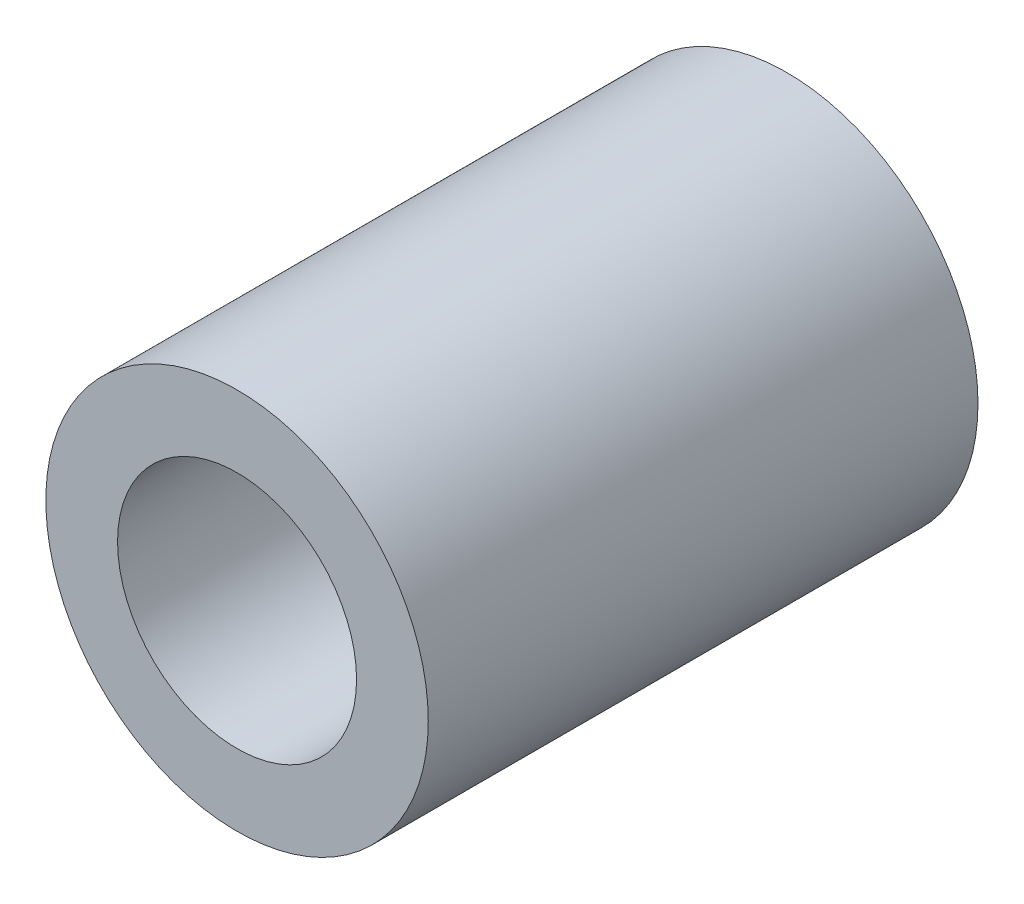
ISO-10303-21;
HEADER;
FILE_DESCRIPTION(('STEP AP214'),'2;1');
FILE_NAME('part.step','',(''),(''),'','','');
FILE_SCHEMA(('AUTOMOTIVE_DESIGN { 1 0 10303 214 1 1 1 1 }'));
ENDSEC;
DATA;
#1=APPLICATION_CONTEXT('core data for automotive mechanical design processes');
#2=APPLICATION_PROTOCOL_DEFINITION('international standard','automotive_design',2000,#1);
#3=PRODUCT_CONTEXT('',#1,'mechanical');
#4=PRODUCT('Part','Part','',(#3));
#5=PRODUCT_RELATED_PRODUCT_CATEGORY('part','',(#4));
#6=PRODUCT_DEFINITION_FORMATION('','',#4);
#7=PRODUCT_DEFINITION_CONTEXT('part definition',#1,'design');
#8=PRODUCT_DEFINITION('design','',#6,#7);
#9=PRODUCT_DEFINITION_SHAPE('','',#8);
#10=(LENGTH_UNIT() NAMED_UNIT(*) SI_UNIT(.MILLI.,.METRE.));
#11=(NAMED_UNIT(*) PLANE_ANGLE_UNIT() SI_UNIT($,.RADIAN.));
#12=(NAMED_UNIT(*) SI_UNIT($,.STERADIAN.) SOLID_ANGLE_UNIT());
#13=UNCERTAINTY_MEASURE_WITH_UNIT(LENGTH_MEASURE(1.E-05),#10,'distance_accuracy_value','');
#14=(GEOMETRIC_REPRESENTATION_CONTEXT(3) GLOBAL_UNCERTAINTY_ASSIGNED_CONTEXT((#13)) GLOBAL_UNIT_ASSIGNED_CONTEXT((#10,
#11,#12)) REPRESENTATION_CONTEXT('',''));
#15=CARTESIAN_POINT('',(0.,0.,0.));
#16=DIRECTION('',(0.,0.,1.));
#17=DIRECTION('',(1.,0.,0.));
#18=AXIS2_PLACEMENT_3D('',#15,#16,#17);
#19=CARTESIAN_POINT('',(0.,0.,23.));
#20=DIRECTION('',(0.,0.,-1.));
#21=DIRECTION('',(-1.00000000000001,0.,0.));
#22=AXIS2_PLACEMENT_3D('',#19,#20,#21);
#23=CYLINDRICAL_SURFACE('',#22,2.5);
#24=CARTESIAN_POINT('',(0.,0.,0.));
#25=DIRECTION('',(0.,0.,1.));
#26=DIRECTION('',(1.00000000000001,0.,0.));
#27=AXIS2_PLACEMENT_3D('',#24,#25,#26);
#28=CIRCLE('',#27,2.5);
#29=CARTESIAN_POINT('',(2.50000000000002,0.,0.));
#30=VERTEX_POINT('',#29);
#31=EDGE_CURVE('E58',#30,#30,#28,.T.);
#32=ORIENTED_EDGE('',*,*,#31,.F.);
#33=EDGE_LOOP('',(#32));
#34=FACE_BOUND('',#33,.T.);
#35=CARTESIAN_POINT('',(0.,0.,11.5));
#36=DIRECTION('',(0.,0.,1.));
#37=DIRECTION('',(1.00000000000001,0.,0.));
#38=AXIS2_PLACEMENT_3D('',#35,#36,#37);
#39=CIRCLE('',#38,2.5);
#40=CARTESIAN_POINT('',(2.50000000000001,0.,11.5));
#41=VERTEX_POINT('',#40);
#42=EDGE_CURVE('E46',#41,#41,#39,.T.);
#43=ORIENTED_EDGE('',*,*,#42,.T.);
#44=EDGE_LOOP('',(#43));
#45=FACE_BOUND('',#44,.T.);
#46=ADVANCED_FACE('F42',(#34,#45),#23,.F.);
#47=CARTESIAN_POINT('',(0.,0.,23.));
#48=DIRECTION('',(0.,0.,1.));
#49=DIRECTION('',(1.00000000000001,0.,0.));
#50=AXIS2_PLACEMENT_3D('',#47,#48,#49);
#51=PLANE('',#50);
#52=CARTESIAN_POINT('',(0.,0.,23.));
#53=DIRECTION('',(0.,0.,1.));
#54=DIRECTION('',(1.00000000000001,0.,0.));
#55=AXIS2_PLACEMENT_3D('',#52,#53,#54);
#56=CIRCLE('',#55,5.);
#57=CARTESIAN_POINT('',(5.00000000000003,0.,23.));
#58=VERTEX_POINT('',#57);
#59=EDGE_CURVE('E63',#58,#58,#56,.T.);
#60=ORIENTED_EDGE('',*,*,#59,.F.);
#61=EDGE_LOOP('',(#60));
#62=FACE_BOUND('',#61,.T.);
#63=CARTESIAN_POINT('',(0.,0.,23.));
#64=DIRECTION('',(0.,0.,1.));
#65=DIRECTION('',(1.00000000000001,0.,0.));
#66=AXIS2_PLACEMENT_3D('',#63,#64,#65);
#67=CIRCLE('',#66,8.);
#68=CARTESIAN_POINT('',(8.00000000000005,0.,23.));
#69=VERTEX_POINT('',#68);
#70=EDGE_CURVE('E10',#69,#69,#67,.T.);
#71=ORIENTED_EDGE('',*,*,#70,.T.);
#72=EDGE_LOOP('',(#71));
#73=FACE_BOUND('',#72,.T.);
#74=ADVANCED_FACE('F89',(#62,#73),#51,.T.);
#75=CARTESIAN_POINT('',(0.,0.,0.));
#76=DIRECTION('',(0.,0.,1.));
#77=DIRECTION('',(1.00000000000001,0.,0.));
#78=AXIS2_PLACEMENT_3D('',#75,#76,#77);
#79=PLANE('',#78);
#80=CARTESIAN_POINT('',(0.,0.,0.));
#81=DIRECTION('',(0.,0.,1.));
#82=DIRECTION('',(1.00000000000001,0.,0.));
#83=AXIS2_PLACEMENT_3D('',#80,#81,#82);
#84=CIRCLE('',#83,8.);
#85=CARTESIAN_POINT('',(8.00000000000005,0.,0.));
#86=VERTEX_POINT('',#85);
#87=EDGE_CURVE('E51',#86,#86,#84,.T.);
#88=ORIENTED_EDGE('',*,*,#87,.F.);
#89=EDGE_LOOP('',(#88));
#90=FACE_BOUND('',#89,.T.);
#91=ORIENTED_EDGE('',*,*,#31,.T.);
#92=EDGE_LOOP('',(#91));
#93=FACE_BOUND('',#92,.T.);
#94=ADVANCED_FACE('F95',(#90,#93),#79,.F.);
#95=CARTESIAN_POINT('',(0.,0.,23.));
#96=DIRECTION('',(0.,0.,-1.));
#97=DIRECTION('',(-1.00000000000001,0.,0.));
#98=AXIS2_PLACEMENT_3D('',#95,#96,#97);
#99=CYLINDRICAL_SURFACE('',#98,8.);
#100=ORIENTED_EDGE('',*,*,#70,.F.);
#101=EDGE_LOOP('',(#100));
#102=FACE_BOUND('',#101,.T.);
#103=ORIENTED_EDGE('',*,*,#87,.T.);
#104=EDGE_LOOP('',(#103));
#105=FACE_BOUND('',#104,.T.);
#106=ADVANCED_FACE('F44',(#102,#105),#99,.T.);
#107=CARTESIAN_POINT('',(0.,0.,11.5));
#108=DIRECTION('',(0.,0.,1.));
#109=DIRECTION('',(1.00000000000001,0.,0.));
#110=AXIS2_PLACEMENT_3D('',#107,#108,#109);
#111=CYLINDRICAL_SURFACE('',#110,5.);
#112=CARTESIAN_POINT('',(0.,0.,11.5));
#113=DIRECTION('',(0.,0.,1.));
#114=DIRECTION('',(1.00000000000001,0.,0.));
#115=AXIS2_PLACEMENT_3D('',#112,#113,#114);
#116=CIRCLE('',#115,5.);
#117=CARTESIAN_POINT('',(5.00000000000003,0.,11.5));
#118=VERTEX_POINT('',#117);
#119=EDGE_CURVE('E67',#118,#118,#116,.T.);
#120=ORIENTED_EDGE('',*,*,#119,.F.);
#121=EDGE_LOOP('',(#120));
#122=FACE_BOUND('',#121,.T.);
#123=ORIENTED_EDGE('',*,*,#59,.T.);
#124=EDGE_LOOP('',(#123));
#125=FACE_BOUND('',#124,.T.);
#126=ADVANCED_FACE('F81',(#122,#125),#111,.F.);
#127=CARTESIAN_POINT('',(0.,0.,11.5));
#128=DIRECTION('',(0.,0.,1.));
#129=DIRECTION('',(1.00000000000001,0.,0.));
#130=AXIS2_PLACEMENT_3D('',#127,#128,#129);
#131=PLANE('',#130);
#132=ORIENTED_EDGE('',*,*,#42,.F.);
#133=EDGE_LOOP('',(#132));
#134=FACE_BOUND('',#133,.T.);
#135=ORIENTED_EDGE('',*,*,#119,.T.);
#136=EDGE_LOOP('',(#135));
#137=FACE_BOUND('',#136,.T.);
#138=ADVANCED_FACE('F79',(#134,#137),#131,.T.);
#139=CLOSED_SHELL('',(#46,#74,#94,#106,#126,#138));
#140=MANIFOLD_SOLID_BREP('B2',#139);
#141=ADVANCED_BREP_SHAPE_REPRESENTATION('',(#18,#140),#14);
#142=SHAPE_DEFINITION_REPRESENTATION(#9,#141);
ENDSEC;
END-ISO-10303-21;
